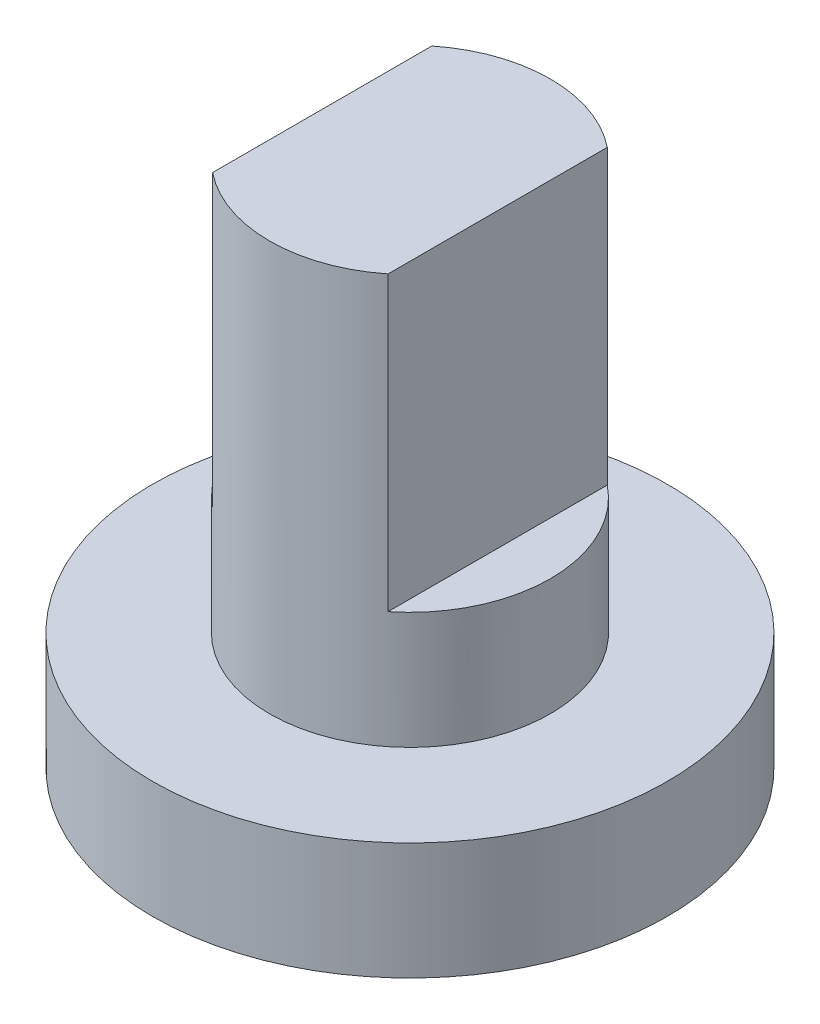
ISO-10303-21;
HEADER;
FILE_DESCRIPTION(('STEP AP214'),'2;1');
FILE_NAME('part.step','',(''),(''),'','','');
FILE_SCHEMA(('AUTOMOTIVE_DESIGN { 1 0 10303 214 1 1 1 1 }'));
ENDSEC;
DATA;
#1=APPLICATION_CONTEXT('core data for automotive mechanical design processes');
#2=APPLICATION_PROTOCOL_DEFINITION('international standard','automotive_design',2000,#1);
#3=PRODUCT_CONTEXT('',#1,'mechanical');
#4=PRODUCT('Part','Part','',(#3));
#5=PRODUCT_RELATED_PRODUCT_CATEGORY('part','',(#4));
#6=PRODUCT_DEFINITION_FORMATION('','',#4);
#7=PRODUCT_DEFINITION_CONTEXT('part definition',#1,'design');
#8=PRODUCT_DEFINITION('design','',#6,#7);
#9=PRODUCT_DEFINITION_SHAPE('','',#8);
#10=(LENGTH_UNIT() NAMED_UNIT(*) SI_UNIT(.MILLI.,.METRE.));
#11=(NAMED_UNIT(*) PLANE_ANGLE_UNIT() SI_UNIT($,.RADIAN.));
#12=(NAMED_UNIT(*) SI_UNIT($,.STERADIAN.) SOLID_ANGLE_UNIT());
#13=UNCERTAINTY_MEASURE_WITH_UNIT(LENGTH_MEASURE(1.E-05),#10,'distance_accuracy_value','');
#14=(GEOMETRIC_REPRESENTATION_CONTEXT(3) GLOBAL_UNCERTAINTY_ASSIGNED_CONTEXT((#13)) GLOBAL_UNIT_ASSIGNED_CONTEXT((#10,
#11,#12)) REPRESENTATION_CONTEXT('',''));
#15=CARTESIAN_POINT('',(0.,0.,0.));
#16=DIRECTION('',(0.,0.,1.));
#17=DIRECTION('',(1.,0.,0.));
#18=AXIS2_PLACEMENT_3D('',#15,#16,#17);
#19=CARTESIAN_POINT('',(0.,4.,0.));
#20=DIRECTION('',(0.,1.,0.));
#21=DIRECTION('',(0.,0.,1.));
#22=AXIS2_PLACEMENT_3D('',#19,#20,#21);
#23=PLANE('',#22);
#24=CARTESIAN_POINT('',(0.,4.,0.));
#25=DIRECTION('',(0.,1.,0.));
#26=DIRECTION('',(0.,0.,1.));
#27=AXIS2_PLACEMENT_3D('',#24,#25,#26);
#28=CIRCLE('',#27,2.4);
#29=CARTESIAN_POINT('',(1.5,4.,1.87349939951952));
#30=VERTEX_POINT('',#29);
#31=CARTESIAN_POINT('',(1.5,4.,-1.87349939951952));
#32=VERTEX_POINT('',#31);
#33=EDGE_CURVE('E98',#30,#32,#28,.T.);
#34=ORIENTED_EDGE('',*,*,#33,.T.);
#35=DIRECTION('',(0.,0.,1.));
#36=VECTOR('',#35,1.);
#37=CARTESIAN_POINT('',(1.5,4.,0.));
#38=LINE('',#37,#36);
#39=EDGE_CURVE('E109',#32,#30,#38,.T.);
#40=ORIENTED_EDGE('',*,*,#39,.T.);
#41=EDGE_LOOP('',(#34,#40));
#42=FACE_BOUND('',#41,.T.);
#43=ADVANCED_FACE('F38',(#42),#23,.T.);
#44=CARTESIAN_POINT('',(0.,2.,0.));
#45=DIRECTION('',(0.,-1.,0.));
#46=DIRECTION('',(0.,0.,-1.));
#47=AXIS2_PLACEMENT_3D('',#44,#45,#46);
#48=CYLINDRICAL_SURFACE('',#47,4.4);
#49=CARTESIAN_POINT('',(0.,2.,0.));
#50=DIRECTION('',(0.,1.,0.));
#51=DIRECTION('',(0.,0.,1.));
#52=AXIS2_PLACEMENT_3D('',#49,#50,#51);
#53=CIRCLE('',#52,4.4);
#54=CARTESIAN_POINT('',(0.,2.,4.4));
#55=VERTEX_POINT('',#54);
#56=EDGE_CURVE('E47',#55,#55,#53,.T.);
#57=ORIENTED_EDGE('',*,*,#56,.F.);
#58=EDGE_LOOP('',(#57));
#59=FACE_BOUND('',#58,.T.);
#60=CARTESIAN_POINT('',(0.,0.,0.));
#61=DIRECTION('',(0.,1.,0.));
#62=DIRECTION('',(0.,0.,1.));
#63=AXIS2_PLACEMENT_3D('',#60,#61,#62);
#64=CIRCLE('',#63,4.4);
#65=CARTESIAN_POINT('',(0.,0.,4.4));
#66=VERTEX_POINT('',#65);
#67=EDGE_CURVE('E42',#66,#66,#64,.T.);
#68=ORIENTED_EDGE('',*,*,#67,.T.);
#69=EDGE_LOOP('',(#68));
#70=FACE_BOUND('',#69,.T.);
#71=ADVANCED_FACE('F40',(#59,#70),#48,.T.);
#72=CARTESIAN_POINT('',(0.,2.,0.));
#73=DIRECTION('',(0.,1.,0.));
#74=DIRECTION('',(0.,0.,1.));
#75=AXIS2_PLACEMENT_3D('',#72,#73,#74);
#76=PLANE('',#75);
#77=CARTESIAN_POINT('',(0.,2.,0.));
#78=DIRECTION('',(0.,1.,0.));
#79=DIRECTION('',(0.,0.,1.));
#80=AXIS2_PLACEMENT_3D('',#77,#78,#79);
#81=CIRCLE('',#80,2.4);
#82=CARTESIAN_POINT('',(0.,2.,2.4));
#83=VERTEX_POINT('',#82);
#84=EDGE_CURVE('E11',#83,#83,#81,.T.);
#85=ORIENTED_EDGE('',*,*,#84,.F.);
#86=EDGE_LOOP('',(#85));
#87=FACE_BOUND('',#86,.T.);
#88=ORIENTED_EDGE('',*,*,#56,.T.);
#89=EDGE_LOOP('',(#88));
#90=FACE_BOUND('',#89,.T.);
#91=ADVANCED_FACE('F124',(#87,#90),#76,.T.);
#92=CARTESIAN_POINT('',(0.,0.,0.));
#93=DIRECTION('',(0.,1.,0.));
#94=DIRECTION('',(0.,0.,1.));
#95=AXIS2_PLACEMENT_3D('',#92,#93,#94);
#96=PLANE('',#95);
#97=ORIENTED_EDGE('',*,*,#67,.F.);
#98=EDGE_LOOP('',(#97));
#99=FACE_BOUND('',#98,.T.);
#100=ADVANCED_FACE('F122',(#99),#96,.F.);
#101=CARTESIAN_POINT('',(0.,4.,0.));
#102=DIRECTION('',(0.,-1.,0.));
#103=DIRECTION('',(0.,0.,-1.));
#104=AXIS2_PLACEMENT_3D('',#101,#102,#103);
#105=CYLINDRICAL_SURFACE('',#104,2.4);
#106=ORIENTED_EDGE('',*,*,#33,.F.);
#107=DIRECTION('',(0.,-1.,0.));
#108=VECTOR('',#107,1.);
#109=CARTESIAN_POINT('',(1.5,9.,1.87349939951952));
#110=LINE('',#109,#108);
#111=CARTESIAN_POINT('',(1.5,9.,1.87349939951952));
#112=VERTEX_POINT('',#111);
#113=EDGE_CURVE('E55',#112,#30,#110,.T.);
#114=ORIENTED_EDGE('',*,*,#113,.F.);
#115=CARTESIAN_POINT('',(0.,9.,0.));
#116=DIRECTION('',(0.,1.,0.));
#117=DIRECTION('',(0.,0.,1.));
#118=AXIS2_PLACEMENT_3D('',#115,#116,#117);
#119=CIRCLE('',#118,2.4);
#120=CARTESIAN_POINT('',(-1.5,9.,1.87349939951952));
#121=VERTEX_POINT('',#120);
#122=EDGE_CURVE('E88',#121,#112,#119,.T.);
#123=ORIENTED_EDGE('',*,*,#122,.F.);
#124=DIRECTION('',(0.,-1.,0.));
#125=VECTOR('',#124,1.);
#126=CARTESIAN_POINT('',(-1.5,9.,1.87349939951952));
#127=LINE('',#126,#125);
#128=CARTESIAN_POINT('',(-1.5,4.,1.87349939951952));
#129=VERTEX_POINT('',#128);
#130=EDGE_CURVE('E99',#121,#129,#127,.T.);
#131=ORIENTED_EDGE('',*,*,#130,.T.);
#132=CARTESIAN_POINT('',(-1.5,4.,-1.87349939951952));
#133=VERTEX_POINT('',#132);
#134=EDGE_CURVE('E114',#133,#129,#28,.T.);
#135=ORIENTED_EDGE('',*,*,#134,.F.);
#136=DIRECTION('',(0.,-1.,0.));
#137=VECTOR('',#136,1.);
#138=CARTESIAN_POINT('',(-1.5,9.,-1.87349939951952));
#139=LINE('',#138,#137);
#140=CARTESIAN_POINT('',(-1.5,9.,-1.87349939951952));
#141=VERTEX_POINT('',#140);
#142=EDGE_CURVE('E82',#141,#133,#139,.T.);
#143=ORIENTED_EDGE('',*,*,#142,.F.);
#144=CARTESIAN_POINT('',(0.,9.,0.));
#145=DIRECTION('',(0.,1.,0.));
#146=DIRECTION('',(0.,0.,1.));
#147=AXIS2_PLACEMENT_3D('',#144,#145,#146);
#148=CIRCLE('',#147,2.4);
#149=CARTESIAN_POINT('',(1.5,9.,-1.87349939951952));
#150=VERTEX_POINT('',#149);
#151=EDGE_CURVE('E64',#150,#141,#148,.T.);
#152=ORIENTED_EDGE('',*,*,#151,.F.);
#153=DIRECTION('',(0.,-1.,0.));
#154=VECTOR('',#153,1.);
#155=CARTESIAN_POINT('',(1.5,9.,-1.87349939951952));
#156=LINE('',#155,#154);
#157=EDGE_CURVE('E100',#150,#32,#156,.T.);
#158=ORIENTED_EDGE('',*,*,#157,.T.);
#159=EDGE_LOOP('',(#106,#114,#123,#131,#135,#143,#152,#158));
#160=FACE_BOUND('',#159,.T.);
#161=ORIENTED_EDGE('',*,*,#84,.T.);
#162=EDGE_LOOP('',(#161));
#163=FACE_BOUND('',#162,.T.);
#164=ADVANCED_FACE('F95',(#160,#163),#105,.T.);
#165=DIRECTION('',(0.,0.,1.));
#166=VECTOR('',#165,1.);
#167=CARTESIAN_POINT('',(-1.5,4.,0.));
#168=LINE('',#167,#166);
#169=EDGE_CURVE('E107',#133,#129,#168,.T.);
#170=ORIENTED_EDGE('',*,*,#169,.F.);
#171=ORIENTED_EDGE('',*,*,#134,.T.);
#172=EDGE_LOOP('',(#170,#171));
#173=FACE_BOUND('',#172,.T.);
#174=ADVANCED_FACE('F129',(#173),#23,.T.);
#175=CARTESIAN_POINT('',(-1.5,9.,0.));
#176=DIRECTION('',(1.,0.,0.));
#177=DIRECTION('',(0.,0.,-1.));
#178=AXIS2_PLACEMENT_3D('',#175,#176,#177);
#179=PLANE('',#178);
#180=ORIENTED_EDGE('',*,*,#169,.T.);
#181=ORIENTED_EDGE('',*,*,#130,.F.);
#182=DIRECTION('',(0.,0.,1.));
#183=VECTOR('',#182,1.);
#184=CARTESIAN_POINT('',(-1.5,9.,0.));
#185=LINE('',#184,#183);
#186=EDGE_CURVE('E91',#141,#121,#185,.T.);
#187=ORIENTED_EDGE('',*,*,#186,.F.);
#188=ORIENTED_EDGE('',*,*,#142,.T.);
#189=EDGE_LOOP('',(#180,#181,#187,#188));
#190=FACE_BOUND('',#189,.T.);
#191=ADVANCED_FACE('F142',(#190),#179,.F.);
#192=CARTESIAN_POINT('',(1.5,9.,0.));
#193=DIRECTION('',(1.,0.,0.));
#194=DIRECTION('',(0.,0.,-1.));
#195=AXIS2_PLACEMENT_3D('',#192,#193,#194);
#196=PLANE('',#195);
#197=ORIENTED_EDGE('',*,*,#39,.F.);
#198=ORIENTED_EDGE('',*,*,#157,.F.);
#199=DIRECTION('',(0.,0.,1.));
#200=VECTOR('',#199,1.);
#201=CARTESIAN_POINT('',(1.5,9.,0.));
#202=LINE('',#201,#200);
#203=EDGE_CURVE('E90',#150,#112,#202,.T.);
#204=ORIENTED_EDGE('',*,*,#203,.T.);
#205=ORIENTED_EDGE('',*,*,#113,.T.);
#206=EDGE_LOOP('',(#197,#198,#204,#205));
#207=FACE_BOUND('',#206,.T.);
#208=ADVANCED_FACE('F102',(#207),#196,.T.);
#209=CARTESIAN_POINT('',(0.,9.,0.));
#210=DIRECTION('',(0.,1.,0.));
#211=DIRECTION('',(0.,0.,1.));
#212=AXIS2_PLACEMENT_3D('',#209,#210,#211);
#213=PLANE('',#212);
#214=ORIENTED_EDGE('',*,*,#186,.T.);
#215=ORIENTED_EDGE('',*,*,#122,.T.);
#216=ORIENTED_EDGE('',*,*,#203,.F.);
#217=ORIENTED_EDGE('',*,*,#151,.T.);
#218=EDGE_LOOP('',(#214,#215,#216,#217));
#219=FACE_BOUND('',#218,.T.);
#220=ADVANCED_FACE('F89',(#219),#213,.T.);
#221=CLOSED_SHELL('',(#43,#71,#91,#100,#164,#174,#191,#208,#220));
#222=MANIFOLD_SOLID_BREP('B2',#221);
#223=ADVANCED_BREP_SHAPE_REPRESENTATION('',(#18,#222),#14);
#224=SHAPE_DEFINITION_REPRESENTATION(#9,#223);
ENDSEC;
END-ISO-10303-21;
